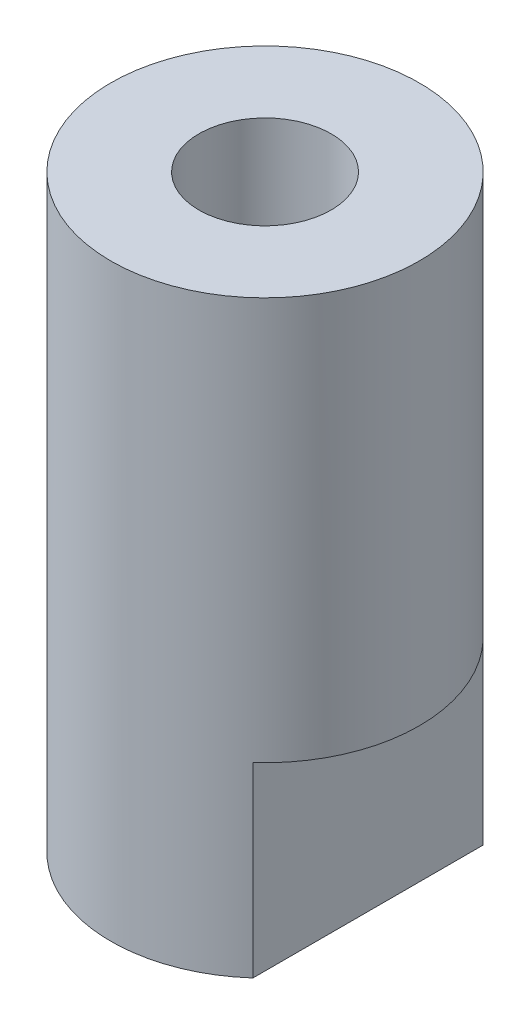
ISO-10303-21;
HEADER;
FILE_DESCRIPTION(('STEP AP214'),'2;1');
FILE_NAME('part.step','',(''),(''),'','','');
FILE_SCHEMA(('AUTOMOTIVE_DESIGN { 1 0 10303 214 1 1 1 1 }'));
ENDSEC;
DATA;
#1=APPLICATION_CONTEXT('core data for automotive mechanical design processes');
#2=APPLICATION_PROTOCOL_DEFINITION('international standard','automotive_design',2000,#1);
#3=PRODUCT_CONTEXT('',#1,'mechanical');
#4=PRODUCT('Part','Part','',(#3));
#5=PRODUCT_RELATED_PRODUCT_CATEGORY('part','',(#4));
#6=PRODUCT_DEFINITION_FORMATION('','',#4);
#7=PRODUCT_DEFINITION_CONTEXT('part definition',#1,'design');
#8=PRODUCT_DEFINITION('design','',#6,#7);
#9=PRODUCT_DEFINITION_SHAPE('','',#8);
#10=(LENGTH_UNIT() NAMED_UNIT(*) SI_UNIT(.MILLI.,.METRE.));
#11=(NAMED_UNIT(*) PLANE_ANGLE_UNIT() SI_UNIT($,.RADIAN.));
#12=(NAMED_UNIT(*) SI_UNIT($,.STERADIAN.) SOLID_ANGLE_UNIT());
#13=UNCERTAINTY_MEASURE_WITH_UNIT(LENGTH_MEASURE(1.E-05),#10,'distance_accuracy_value','');
#14=(GEOMETRIC_REPRESENTATION_CONTEXT(3) GLOBAL_UNCERTAINTY_ASSIGNED_CONTEXT((#13)) GLOBAL_UNIT_ASSIGNED_CONTEXT((#10,
#11,#12)) REPRESENTATION_CONTEXT('',''));
#15=CARTESIAN_POINT('',(0.,0.,0.));
#16=DIRECTION('',(0.,0.,1.));
#17=DIRECTION('',(1.,0.,0.));
#18=AXIS2_PLACEMENT_3D('',#15,#16,#17);
#19=CARTESIAN_POINT('',(0.,40.1,0.));
#20=DIRECTION('',(0.,-1.,0.));
#21=DIRECTION('',(0.,0.,-1.));
#22=AXIS2_PLACEMENT_3D('',#19,#20,#21);
#23=CYLINDRICAL_SURFACE('',#22,10.5);
#24=CARTESIAN_POINT('',(0.,40.1,0.));
#25=DIRECTION('',(0.,1.,0.));
#26=DIRECTION('',(0.,0.,1.));
#27=AXIS2_PLACEMENT_3D('',#24,#25,#26);
#28=CIRCLE('',#27,10.5);
#29=CARTESIAN_POINT('',(0.,40.1,10.5));
#30=VERTEX_POINT('',#29);
#31=EDGE_CURVE('E88',#30,#30,#28,.T.);
#32=ORIENTED_EDGE('',*,*,#31,.F.);
#33=EDGE_LOOP('',(#32));
#34=FACE_BOUND('',#33,.T.);
#35=CARTESIAN_POINT('',(0.,12.7,0.));
#36=DIRECTION('',(0.,1.,0.));
#37=DIRECTION('',(0.,0.,1.));
#38=AXIS2_PLACEMENT_3D('',#35,#36,#37);
#39=CIRCLE('',#38,10.5);
#40=CARTESIAN_POINT('',(-7.,12.7,-7.82623792124927));
#41=VERTEX_POINT('',#40);
#42=CARTESIAN_POINT('',(-7.,12.7,7.82623792124926));
#43=VERTEX_POINT('',#42);
#44=EDGE_CURVE('E11',#41,#43,#39,.T.);
#45=ORIENTED_EDGE('',*,*,#44,.T.);
#46=DIRECTION('',(0.,-1.,0.));
#47=VECTOR('',#46,1.);
#48=CARTESIAN_POINT('',(-6.99999999999999,40.1,7.82623792124927));
#49=LINE('',#48,#47);
#50=CARTESIAN_POINT('',(-7.,0.,7.82623792124926));
#51=VERTEX_POINT('',#50);
#52=EDGE_CURVE('E113',#43,#51,#49,.T.);
#53=ORIENTED_EDGE('',*,*,#52,.T.);
#54=CARTESIAN_POINT('',(0.,0.,0.));
#55=DIRECTION('',(0.,1.,0.));
#56=DIRECTION('',(0.,0.,1.));
#57=AXIS2_PLACEMENT_3D('',#54,#55,#56);
#58=CIRCLE('',#57,10.5);
#59=CARTESIAN_POINT('',(7.,0.,7.82623792124926));
#60=VERTEX_POINT('',#59);
#61=EDGE_CURVE('E96',#51,#60,#58,.T.);
#62=ORIENTED_EDGE('',*,*,#61,.T.);
#63=DIRECTION('',(0.,-1.,0.));
#64=VECTOR('',#63,1.);
#65=CARTESIAN_POINT('',(7.,40.1,7.82623792124926));
#66=LINE('',#65,#64);
#67=CARTESIAN_POINT('',(7.,12.7,7.82623792124926));
#68=VERTEX_POINT('',#67);
#69=EDGE_CURVE('E62',#60,#68,#66,.F.);
#70=ORIENTED_EDGE('',*,*,#69,.T.);
#71=CARTESIAN_POINT('',(0.,12.7,0.));
#72=DIRECTION('',(0.,1.,0.));
#73=DIRECTION('',(-1.,0.,0.));
#74=AXIS2_PLACEMENT_3D('',#71,#72,#73);
#75=CIRCLE('',#74,10.5);
#76=CARTESIAN_POINT('',(7.,12.7,-7.82623792124926));
#77=VERTEX_POINT('',#76);
#78=EDGE_CURVE('E47',#68,#77,#75,.T.);
#79=ORIENTED_EDGE('',*,*,#78,.T.);
#80=DIRECTION('',(0.,-1.,0.));
#81=VECTOR('',#80,1.);
#82=CARTESIAN_POINT('',(7.,40.1,-7.82623792124926));
#83=LINE('',#82,#81);
#84=CARTESIAN_POINT('',(7.,0.,-7.82623792124926));
#85=VERTEX_POINT('',#84);
#86=EDGE_CURVE('E81',#77,#85,#83,.T.);
#87=ORIENTED_EDGE('',*,*,#86,.T.);
#88=CARTESIAN_POINT('',(-7.,0.,-7.82623792124926));
#89=VERTEX_POINT('',#88);
#90=EDGE_CURVE('E93',#85,#89,#58,.T.);
#91=ORIENTED_EDGE('',*,*,#90,.T.);
#92=DIRECTION('',(0.,-1.,0.));
#93=VECTOR('',#92,1.);
#94=CARTESIAN_POINT('',(-6.99999999999999,40.1,-7.82623792124927));
#95=LINE('',#94,#93);
#96=EDGE_CURVE('E54',#89,#41,#95,.F.);
#97=ORIENTED_EDGE('',*,*,#96,.T.);
#98=EDGE_LOOP('',(#45,#53,#62,#70,#79,#87,#91,#97));
#99=FACE_BOUND('',#98,.T.);
#100=ADVANCED_FACE('F40',(#34,#99),#23,.T.);
#101=CARTESIAN_POINT('',(0.,40.1,0.));
#102=DIRECTION('',(0.,1.,0.));
#103=DIRECTION('',(0.,0.,1.));
#104=AXIS2_PLACEMENT_3D('',#101,#102,#103);
#105=PLANE('',#104);
#106=CARTESIAN_POINT('',(0.,40.1,0.));
#107=DIRECTION('',(0.,1.,0.));
#108=DIRECTION('',(0.,0.,1.));
#109=AXIS2_PLACEMENT_3D('',#106,#107,#108);
#110=CIRCLE('',#109,4.49999999999999);
#111=CARTESIAN_POINT('',(0.,40.1,4.49999999999999));
#112=VERTEX_POINT('',#111);
#113=EDGE_CURVE('E105',#112,#112,#110,.T.);
#114=ORIENTED_EDGE('',*,*,#113,.F.);
#115=EDGE_LOOP('',(#114));
#116=FACE_BOUND('',#115,.T.);
#117=ORIENTED_EDGE('',*,*,#31,.T.);
#118=EDGE_LOOP('',(#117));
#119=FACE_BOUND('',#118,.T.);
#120=ADVANCED_FACE('F132',(#116,#119),#105,.T.);
#121=CARTESIAN_POINT('',(0.,0.,0.));
#122=DIRECTION('',(0.,1.,0.));
#123=DIRECTION('',(0.,0.,1.));
#124=AXIS2_PLACEMENT_3D('',#121,#122,#123);
#125=PLANE('',#124);
#126=CARTESIAN_POINT('',(0.,0.,0.));
#127=DIRECTION('',(0.,-1.,0.));
#128=DIRECTION('',(0.,0.,-1.));
#129=AXIS2_PLACEMENT_3D('',#126,#127,#128);
#130=CIRCLE('',#129,3.5);
#131=CARTESIAN_POINT('',(0.,0.,-3.5));
#132=VERTEX_POINT('',#131);
#133=EDGE_CURVE('E106',#132,#132,#130,.T.);
#134=ORIENTED_EDGE('',*,*,#133,.F.);
#135=EDGE_LOOP('',(#134));
#136=FACE_BOUND('',#135,.T.);
#137=ORIENTED_EDGE('',*,*,#61,.F.);
#138=DIRECTION('',(0.,0.,-1.));
#139=VECTOR('',#138,1.);
#140=CARTESIAN_POINT('',(-7.,0.,0.));
#141=LINE('',#140,#139);
#142=EDGE_CURVE('E87',#51,#89,#141,.T.);
#143=ORIENTED_EDGE('',*,*,#142,.T.);
#144=ORIENTED_EDGE('',*,*,#90,.F.);
#145=DIRECTION('',(0.,0.,1.));
#146=VECTOR('',#145,1.);
#147=CARTESIAN_POINT('',(7.,0.,0.));
#148=LINE('',#147,#146);
#149=EDGE_CURVE('E78',#85,#60,#148,.T.);
#150=ORIENTED_EDGE('',*,*,#149,.T.);
#151=EDGE_LOOP('',(#137,#143,#144,#150));
#152=FACE_BOUND('',#151,.T.);
#153=ADVANCED_FACE('F95',(#136,#152),#125,.F.);
#154=CARTESIAN_POINT('',(0.,17.1,0.));
#155=DIRECTION('',(0.,1.,0.));
#156=DIRECTION('',(0.,0.,1.));
#157=AXIS2_PLACEMENT_3D('',#154,#155,#156);
#158=CONICAL_SURFACE('',#157,4.49999999999999,1.02974425867665);
#159=CARTESIAN_POINT('',(0.,16.4991393809725,0.));
#160=DIRECTION('',(0.,1.,0.));
#161=DIRECTION('',(0.,0.,1.));
#162=AXIS2_PLACEMENT_3D('',#159,#160,#161);
#163=CIRCLE('',#162,3.5);
#164=CARTESIAN_POINT('',(0.,16.4991393809725,3.5));
#165=VERTEX_POINT('',#164);
#166=EDGE_CURVE('E103',#165,#165,#163,.F.);
#167=ORIENTED_EDGE('',*,*,#166,.T.);
#168=EDGE_LOOP('',(#167));
#169=FACE_BOUND('',#168,.T.);
#170=CARTESIAN_POINT('',(0.,17.1,0.));
#171=DIRECTION('',(0.,1.,0.));
#172=DIRECTION('',(0.,0.,1.));
#173=AXIS2_PLACEMENT_3D('',#170,#171,#172);
#174=CIRCLE('',#173,4.49999999999999);
#175=CARTESIAN_POINT('',(0.,17.1,4.49999999999999));
#176=VERTEX_POINT('',#175);
#177=EDGE_CURVE('E100',#176,#176,#174,.T.);
#178=ORIENTED_EDGE('',*,*,#177,.T.);
#179=EDGE_LOOP('',(#178));
#180=FACE_BOUND('',#179,.T.);
#181=ADVANCED_FACE('F123',(#169,#180),#158,.F.);
#182=CARTESIAN_POINT('',(0.,40.1,0.));
#183=DIRECTION('',(0.,1.,0.));
#184=DIRECTION('',(0.,0.,1.));
#185=AXIS2_PLACEMENT_3D('',#182,#183,#184);
#186=CYLINDRICAL_SURFACE('',#185,4.49999999999999);
#187=ORIENTED_EDGE('',*,*,#177,.F.);
#188=EDGE_LOOP('',(#187));
#189=FACE_BOUND('',#188,.T.);
#190=ORIENTED_EDGE('',*,*,#113,.T.);
#191=EDGE_LOOP('',(#190));
#192=FACE_BOUND('',#191,.T.);
#193=ADVANCED_FACE('F125',(#189,#192),#186,.F.);
#194=CARTESIAN_POINT('',(0.,0.,0.));
#195=DIRECTION('',(0.,-1.,0.));
#196=DIRECTION('',(0.,0.,-1.));
#197=AXIS2_PLACEMENT_3D('',#194,#195,#196);
#198=CYLINDRICAL_SURFACE('',#197,3.5);
#199=ORIENTED_EDGE('',*,*,#133,.T.);
#200=EDGE_LOOP('',(#199));
#201=FACE_BOUND('',#200,.T.);
#202=ORIENTED_EDGE('',*,*,#166,.F.);
#203=EDGE_LOOP('',(#202));
#204=FACE_BOUND('',#203,.T.);
#205=ADVANCED_FACE('F128',(#201,#204),#198,.F.);
#206=CARTESIAN_POINT('',(10.5,12.7,-10.5));
#207=DIRECTION('',(0.,1.,0.));
#208=DIRECTION('',(-1.,0.,0.));
#209=AXIS2_PLACEMENT_3D('',#206,#207,#208);
#210=PLANE('',#209);
#211=DIRECTION('',(0.,0.,1.));
#212=VECTOR('',#211,1.);
#213=CARTESIAN_POINT('',(7.,12.7,-10.5));
#214=LINE('',#213,#212);
#215=EDGE_CURVE('E245',#77,#68,#214,.T.);
#216=ORIENTED_EDGE('',*,*,#215,.F.);
#217=ORIENTED_EDGE('',*,*,#78,.F.);
#218=EDGE_LOOP('',(#216,#217));
#219=FACE_BOUND('',#218,.T.);
#220=ADVANCED_FACE('F171',(#219),#210,.F.);
#221=CARTESIAN_POINT('',(7.,0.,-10.5));
#222=DIRECTION('',(-1.,0.,0.));
#223=DIRECTION('',(0.,0.,1.));
#224=AXIS2_PLACEMENT_3D('',#221,#222,#223);
#225=PLANE('',#224);
#226=ORIENTED_EDGE('',*,*,#215,.T.);
#227=ORIENTED_EDGE('',*,*,#69,.F.);
#228=ORIENTED_EDGE('',*,*,#149,.F.);
#229=ORIENTED_EDGE('',*,*,#86,.F.);
#230=EDGE_LOOP('',(#226,#227,#228,#229));
#231=FACE_BOUND('',#230,.T.);
#232=ADVANCED_FACE('F80',(#231),#225,.F.);
#233=CARTESIAN_POINT('',(-10.5,12.7,-10.5));
#234=DIRECTION('',(0.,1.,0.));
#235=DIRECTION('',(0.,0.,1.));
#236=AXIS2_PLACEMENT_3D('',#233,#234,#235);
#237=PLANE('',#236);
#238=DIRECTION('',(0.,0.,1.));
#239=VECTOR('',#238,1.);
#240=CARTESIAN_POINT('',(-7.,12.7,-10.5));
#241=LINE('',#240,#239);
#242=EDGE_CURVE('E244',#41,#43,#241,.T.);
#243=ORIENTED_EDGE('',*,*,#242,.T.);
#244=ORIENTED_EDGE('',*,*,#44,.F.);
#245=EDGE_LOOP('',(#243,#244));
#246=FACE_BOUND('',#245,.T.);
#247=ADVANCED_FACE('F184',(#246),#237,.F.);
#248=CARTESIAN_POINT('',(-7.,0.,-10.5));
#249=DIRECTION('',(1.,0.,0.));
#250=DIRECTION('',(0.,1.,0.));
#251=AXIS2_PLACEMENT_3D('',#248,#249,#250);
#252=PLANE('',#251);
#253=ORIENTED_EDGE('',*,*,#242,.F.);
#254=ORIENTED_EDGE('',*,*,#96,.F.);
#255=ORIENTED_EDGE('',*,*,#142,.F.);
#256=ORIENTED_EDGE('',*,*,#52,.F.);
#257=EDGE_LOOP('',(#253,#254,#255,#256));
#258=FACE_BOUND('',#257,.T.);
#259=ADVANCED_FACE('F191',(#258),#252,.F.);
#260=CLOSED_SHELL('',(#100,#120,#153,#181,#193,#205,#220,#232,#247,#259));
#261=MANIFOLD_SOLID_BREP('B2',#260);
#262=ADVANCED_BREP_SHAPE_REPRESENTATION('',(#18,#261),#14);
#263=SHAPE_DEFINITION_REPRESENTATION(#9,#262);
ENDSEC;
END-ISO-10303-21;
